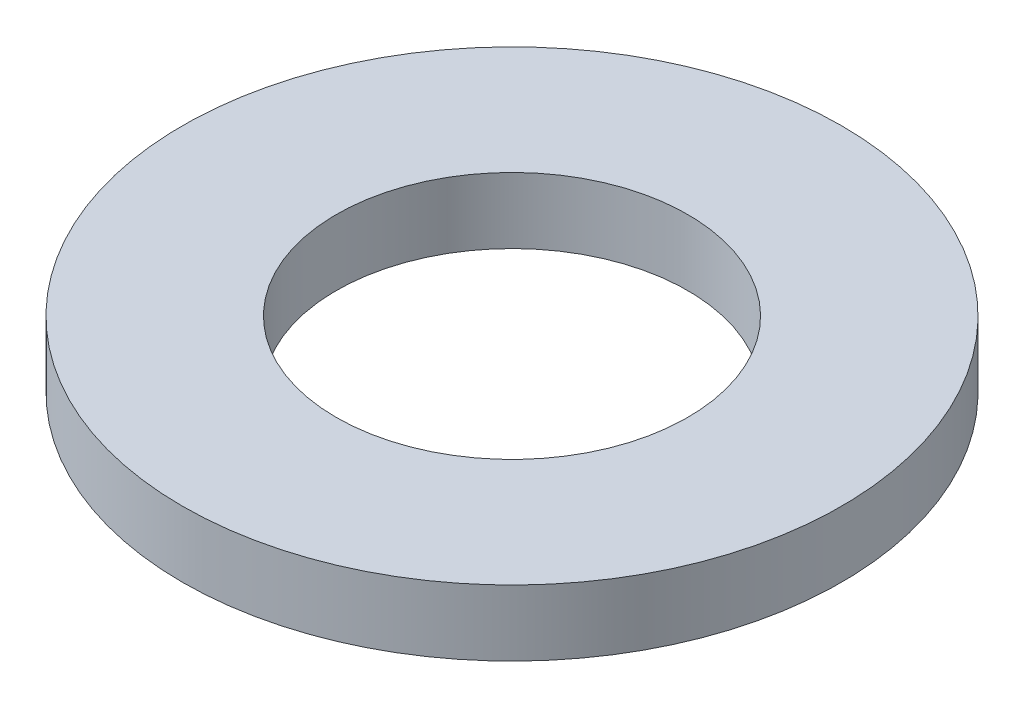
ISO-10303-21;
HEADER;
FILE_DESCRIPTION(('STEP AP214'),'2;1');
FILE_NAME('part.step','',(''),(''),'','','');
FILE_SCHEMA(('AUTOMOTIVE_DESIGN { 1 0 10303 214 1 1 1 1 }'));
ENDSEC;
DATA;
#1=APPLICATION_CONTEXT('core data for automotive mechanical design processes');
#2=APPLICATION_PROTOCOL_DEFINITION('international standard','automotive_design',2000,#1);
#3=PRODUCT_CONTEXT('',#1,'mechanical');
#4=PRODUCT('Part','Part','',(#3));
#5=PRODUCT_RELATED_PRODUCT_CATEGORY('part','',(#4));
#6=PRODUCT_DEFINITION_FORMATION('','',#4);
#7=PRODUCT_DEFINITION_CONTEXT('part definition',#1,'design');
#8=PRODUCT_DEFINITION('design','',#6,#7);
#9=PRODUCT_DEFINITION_SHAPE('','',#8);
#10=(LENGTH_UNIT() NAMED_UNIT(*) SI_UNIT(.MILLI.,.METRE.));
#11=(NAMED_UNIT(*) PLANE_ANGLE_UNIT() SI_UNIT($,.RADIAN.));
#12=(NAMED_UNIT(*) SI_UNIT($,.STERADIAN.) SOLID_ANGLE_UNIT());
#13=UNCERTAINTY_MEASURE_WITH_UNIT(LENGTH_MEASURE(1.E-05),#10,'distance_accuracy_value','');
#14=(GEOMETRIC_REPRESENTATION_CONTEXT(3) GLOBAL_UNCERTAINTY_ASSIGNED_CONTEXT((#13)) GLOBAL_UNIT_ASSIGNED_CONTEXT((#10,
#11,#12)) REPRESENTATION_CONTEXT('',''));
#15=CARTESIAN_POINT('',(0.,0.,0.));
#16=DIRECTION('',(0.,0.,1.));
#17=DIRECTION('',(1.,0.,0.));
#18=AXIS2_PLACEMENT_3D('',#15,#16,#17);
#19=CARTESIAN_POINT('',(0.,1.5,0.));
#20=DIRECTION('',(0.,1.,0.));
#21=DIRECTION('',(0.,0.,1.));
#22=AXIS2_PLACEMENT_3D('',#19,#20,#21);
#23=PLANE('',#22);
#24=CARTESIAN_POINT('',(0.,1.5,0.));
#25=DIRECTION('',(0.,1.,0.));
#26=DIRECTION('',(0.,0.,1.));
#27=AXIS2_PLACEMENT_3D('',#24,#25,#26);
#28=CIRCLE('',#27,7.5);
#29=CARTESIAN_POINT('',(0.,1.5,7.5));
#30=VERTEX_POINT('',#29);
#31=EDGE_CURVE('E10',#30,#30,#28,.T.);
#32=ORIENTED_EDGE('',*,*,#31,.T.);
#33=EDGE_LOOP('',(#32));
#34=FACE_BOUND('',#33,.T.);
#35=CARTESIAN_POINT('',(0.,1.5,0.));
#36=DIRECTION('',(0.,1.,0.));
#37=DIRECTION('',(0.,0.,1.));
#38=AXIS2_PLACEMENT_3D('',#35,#36,#37);
#39=CIRCLE('',#38,4.);
#40=CARTESIAN_POINT('',(0.,1.5,4.));
#41=VERTEX_POINT('',#40);
#42=EDGE_CURVE('E46',#41,#41,#39,.T.);
#43=ORIENTED_EDGE('',*,*,#42,.F.);
#44=EDGE_LOOP('',(#43));
#45=FACE_BOUND('',#44,.T.);
#46=ADVANCED_FACE('F35',(#34,#45),#23,.T.);
#47=CARTESIAN_POINT('',(0.,0.,0.));
#48=DIRECTION('',(0.,1.,0.));
#49=DIRECTION('',(0.,0.,1.));
#50=AXIS2_PLACEMENT_3D('',#47,#48,#49);
#51=PLANE('',#50);
#52=CARTESIAN_POINT('',(0.,0.,0.));
#53=DIRECTION('',(0.,1.,0.));
#54=DIRECTION('',(0.,0.,1.));
#55=AXIS2_PLACEMENT_3D('',#52,#53,#54);
#56=CIRCLE('',#55,7.5);
#57=CARTESIAN_POINT('',(0.,0.,7.5));
#58=VERTEX_POINT('',#57);
#59=EDGE_CURVE('E39',#58,#58,#56,.T.);
#60=ORIENTED_EDGE('',*,*,#59,.F.);
#61=EDGE_LOOP('',(#60));
#62=FACE_BOUND('',#61,.T.);
#63=CARTESIAN_POINT('',(0.,0.,0.));
#64=DIRECTION('',(0.,1.,0.));
#65=DIRECTION('',(0.,0.,1.));
#66=AXIS2_PLACEMENT_3D('',#63,#64,#65);
#67=CIRCLE('',#66,4.);
#68=CARTESIAN_POINT('',(0.,0.,4.));
#69=VERTEX_POINT('',#68);
#70=EDGE_CURVE('E48',#69,#69,#67,.T.);
#71=ORIENTED_EDGE('',*,*,#70,.T.);
#72=EDGE_LOOP('',(#71));
#73=FACE_BOUND('',#72,.T.);
#74=ADVANCED_FACE('F58',(#62,#73),#51,.F.);
#75=CARTESIAN_POINT('',(0.,1.5,0.));
#76=DIRECTION('',(0.,-1.,0.));
#77=DIRECTION('',(0.,0.,-1.));
#78=AXIS2_PLACEMENT_3D('',#75,#76,#77);
#79=CYLINDRICAL_SURFACE('',#78,7.5);
#80=ORIENTED_EDGE('',*,*,#31,.F.);
#81=EDGE_LOOP('',(#80));
#82=FACE_BOUND('',#81,.T.);
#83=ORIENTED_EDGE('',*,*,#59,.T.);
#84=EDGE_LOOP('',(#83));
#85=FACE_BOUND('',#84,.T.);
#86=ADVANCED_FACE('F37',(#82,#85),#79,.T.);
#87=CARTESIAN_POINT('',(0.,1.5,0.));
#88=DIRECTION('',(0.,-1.,0.));
#89=DIRECTION('',(0.,0.,-1.));
#90=AXIS2_PLACEMENT_3D('',#87,#88,#89);
#91=CYLINDRICAL_SURFACE('',#90,4.);
#92=ORIENTED_EDGE('',*,*,#42,.T.);
#93=EDGE_LOOP('',(#92));
#94=FACE_BOUND('',#93,.T.);
#95=ORIENTED_EDGE('',*,*,#70,.F.);
#96=EDGE_LOOP('',(#95));
#97=FACE_BOUND('',#96,.T.);
#98=ADVANCED_FACE('F54',(#94,#97),#91,.F.);
#99=CLOSED_SHELL('',(#46,#74,#86,#98));
#100=MANIFOLD_SOLID_BREP('B2',#99);
#101=ADVANCED_BREP_SHAPE_REPRESENTATION('',(#18,#100),#14);
#102=SHAPE_DEFINITION_REPRESENTATION(#9,#101);
ENDSEC;
END-ISO-10303-21;
